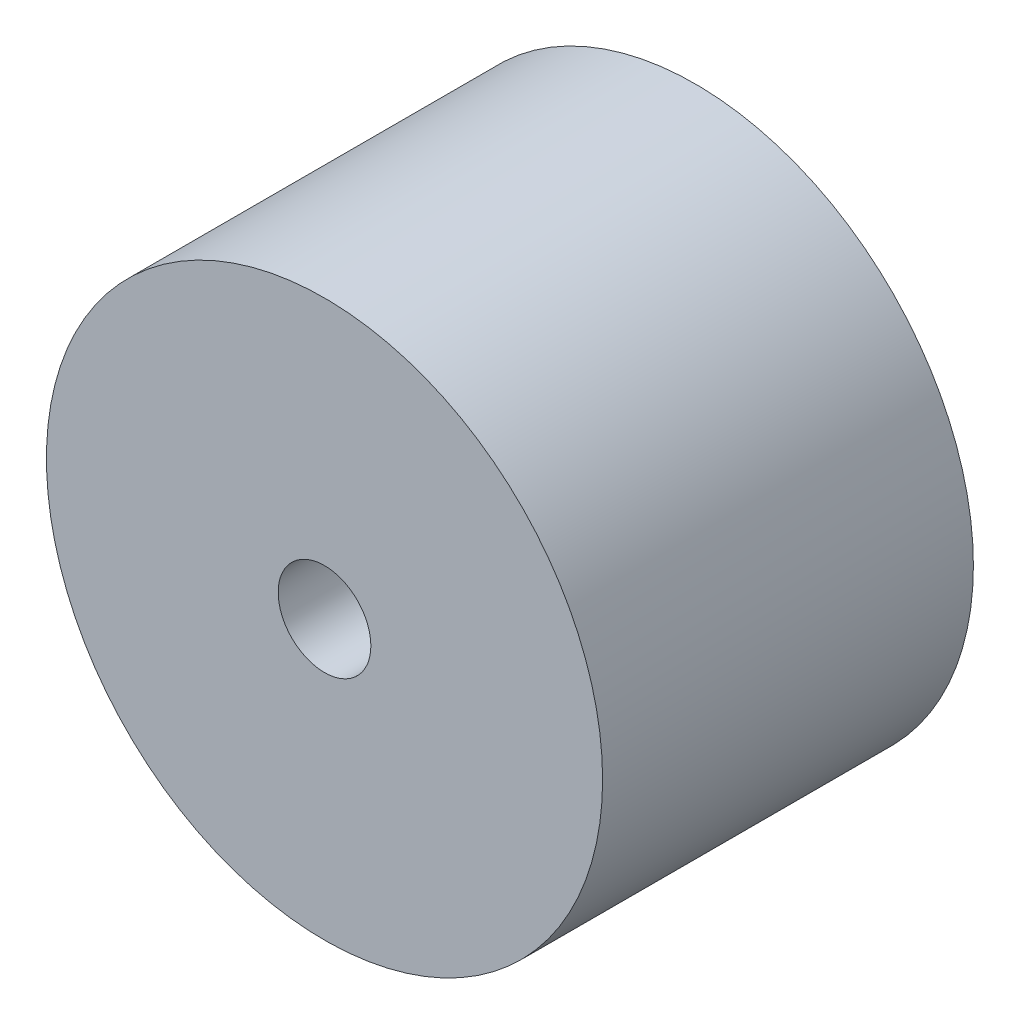
ISO-10303-21;
HEADER;
FILE_DESCRIPTION(('STEP AP214'),'2;1');
FILE_NAME('part.step','',(''),(''),'','','');
FILE_SCHEMA(('AUTOMOTIVE_DESIGN { 1 0 10303 214 1 1 1 1 }'));
ENDSEC;
DATA;
#1=APPLICATION_CONTEXT('core data for automotive mechanical design processes');
#2=APPLICATION_PROTOCOL_DEFINITION('international standard','automotive_design',2000,#1);
#3=PRODUCT_CONTEXT('',#1,'mechanical');
#4=PRODUCT('Part','Part','',(#3));
#5=PRODUCT_RELATED_PRODUCT_CATEGORY('part','',(#4));
#6=PRODUCT_DEFINITION_FORMATION('','',#4);
#7=PRODUCT_DEFINITION_CONTEXT('part definition',#1,'design');
#8=PRODUCT_DEFINITION('design','',#6,#7);
#9=PRODUCT_DEFINITION_SHAPE('','',#8);
#10=(LENGTH_UNIT() NAMED_UNIT(*) SI_UNIT(.MILLI.,.METRE.));
#11=(NAMED_UNIT(*) PLANE_ANGLE_UNIT() SI_UNIT($,.RADIAN.));
#12=(NAMED_UNIT(*) SI_UNIT($,.STERADIAN.) SOLID_ANGLE_UNIT());
#13=UNCERTAINTY_MEASURE_WITH_UNIT(LENGTH_MEASURE(1.E-05),#10,'distance_accuracy_value','');
#14=(GEOMETRIC_REPRESENTATION_CONTEXT(3) GLOBAL_UNCERTAINTY_ASSIGNED_CONTEXT((#13)) GLOBAL_UNIT_ASSIGNED_CONTEXT((#10,
#11,#12)) REPRESENTATION_CONTEXT('',''));
#15=CARTESIAN_POINT('',(0.,0.,0.));
#16=DIRECTION('',(0.,0.,1.));
#17=DIRECTION('',(1.,0.,0.));
#18=AXIS2_PLACEMENT_3D('',#15,#16,#17);
#19=CARTESIAN_POINT('',(0.,0.,20.));
#20=DIRECTION('',(0.,0.,1.));
#21=DIRECTION('',(1.,0.,0.));
#22=AXIS2_PLACEMENT_3D('',#19,#20,#21);
#23=PLANE('',#22);
#24=CARTESIAN_POINT('',(0.,0.,20.));
#25=DIRECTION('',(0.,0.,1.));
#26=DIRECTION('',(1.,0.,0.));
#27=AXIS2_PLACEMENT_3D('',#24,#25,#26);
#28=CIRCLE('',#27,30.);
#29=CARTESIAN_POINT('',(30.,0.,20.));
#30=VERTEX_POINT('',#29);
#31=EDGE_CURVE('E10',#30,#30,#28,.T.);
#32=ORIENTED_EDGE('',*,*,#31,.T.);
#33=EDGE_LOOP('',(#32));
#34=FACE_BOUND('',#33,.T.);
#35=CARTESIAN_POINT('',(0.,0.,20.));
#36=DIRECTION('',(0.,0.,1.));
#37=DIRECTION('',(1.,0.,0.));
#38=AXIS2_PLACEMENT_3D('',#35,#36,#37);
#39=CIRCLE('',#38,5.);
#40=CARTESIAN_POINT('',(5.,0.,20.));
#41=VERTEX_POINT('',#40);
#42=EDGE_CURVE('E50',#41,#41,#39,.T.);
#43=ORIENTED_EDGE('',*,*,#42,.F.);
#44=EDGE_LOOP('',(#43));
#45=FACE_BOUND('',#44,.T.);
#46=ADVANCED_FACE('F37',(#34,#45),#23,.T.);
#47=CARTESIAN_POINT('',(0.,0.,-20.));
#48=DIRECTION('',(0.,0.,1.));
#49=DIRECTION('',(1.,0.,0.));
#50=AXIS2_PLACEMENT_3D('',#47,#48,#49);
#51=PLANE('',#50);
#52=CARTESIAN_POINT('',(0.,0.,-20.));
#53=DIRECTION('',(0.,0.,1.));
#54=DIRECTION('',(1.,0.,0.));
#55=AXIS2_PLACEMENT_3D('',#52,#53,#54);
#56=CIRCLE('',#55,30.);
#57=CARTESIAN_POINT('',(30.,0.,-20.));
#58=VERTEX_POINT('',#57);
#59=EDGE_CURVE('E41',#58,#58,#56,.T.);
#60=ORIENTED_EDGE('',*,*,#59,.F.);
#61=EDGE_LOOP('',(#60));
#62=FACE_BOUND('',#61,.T.);
#63=CARTESIAN_POINT('',(0.,0.,-20.));
#64=DIRECTION('',(0.,0.,1.));
#65=DIRECTION('',(1.,0.,0.));
#66=AXIS2_PLACEMENT_3D('',#63,#64,#65);
#67=CIRCLE('',#66,5.);
#68=CARTESIAN_POINT('',(5.,0.,-20.));
#69=VERTEX_POINT('',#68);
#70=EDGE_CURVE('E52',#69,#69,#67,.T.);
#71=ORIENTED_EDGE('',*,*,#70,.T.);
#72=EDGE_LOOP('',(#71));
#73=FACE_BOUND('',#72,.T.);
#74=ADVANCED_FACE('F64',(#62,#73),#51,.F.);
#75=CARTESIAN_POINT('',(0.,0.,20.));
#76=DIRECTION('',(0.,0.,-1.));
#77=DIRECTION('',(-1.,0.,0.));
#78=AXIS2_PLACEMENT_3D('',#75,#76,#77);
#79=CYLINDRICAL_SURFACE('',#78,30.);
#80=ORIENTED_EDGE('',*,*,#31,.F.);
#81=EDGE_LOOP('',(#80));
#82=FACE_BOUND('',#81,.T.);
#83=ORIENTED_EDGE('',*,*,#59,.T.);
#84=EDGE_LOOP('',(#83));
#85=FACE_BOUND('',#84,.T.);
#86=ADVANCED_FACE('F39',(#82,#85),#79,.T.);
#87=CARTESIAN_POINT('',(0.,0.,20.));
#88=DIRECTION('',(0.,0.,-1.));
#89=DIRECTION('',(-1.,0.,0.));
#90=AXIS2_PLACEMENT_3D('',#87,#88,#89);
#91=CYLINDRICAL_SURFACE('',#90,5.);
#92=ORIENTED_EDGE('',*,*,#42,.T.);
#93=EDGE_LOOP('',(#92));
#94=FACE_BOUND('',#93,.T.);
#95=ORIENTED_EDGE('',*,*,#70,.F.);
#96=EDGE_LOOP('',(#95));
#97=FACE_BOUND('',#96,.T.);
#98=ADVANCED_FACE('F60',(#94,#97),#91,.F.);
#99=CLOSED_SHELL('',(#46,#74,#86,#98));
#100=MANIFOLD_SOLID_BREP('B2',#99);
#101=ADVANCED_BREP_SHAPE_REPRESENTATION('',(#18,#100),#14);
#102=SHAPE_DEFINITION_REPRESENTATION(#9,#101);
ENDSEC;
END-ISO-10303-21;
